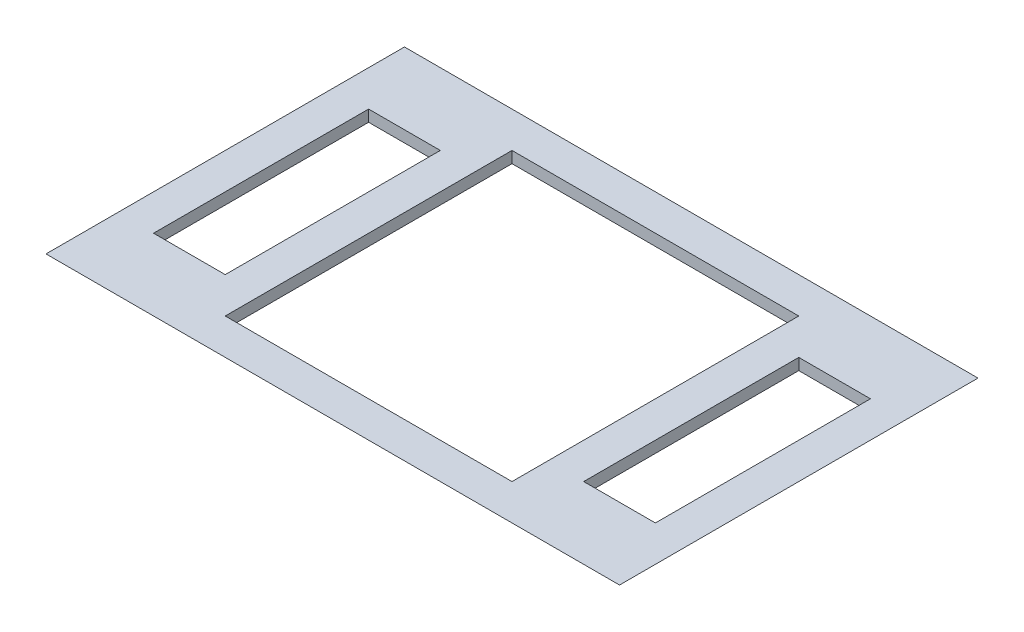
ISO-10303-21;
HEADER;
FILE_DESCRIPTION(('STEP AP214'),'2;1');
FILE_NAME('part.step','',(''),(''),'','','');
FILE_SCHEMA(('AUTOMOTIVE_DESIGN { 1 0 10303 214 1 1 1 1 }'));
ENDSEC;
DATA;
#1=APPLICATION_CONTEXT('core data for automotive mechanical design processes');
#2=APPLICATION_PROTOCOL_DEFINITION('international standard','automotive_design',2000,#1);
#3=PRODUCT_CONTEXT('',#1,'mechanical');
#4=PRODUCT('Part','Part','',(#3));
#5=PRODUCT_RELATED_PRODUCT_CATEGORY('part','',(#4));
#6=PRODUCT_DEFINITION_FORMATION('','',#4);
#7=PRODUCT_DEFINITION_CONTEXT('part definition',#1,'design');
#8=PRODUCT_DEFINITION('design','',#6,#7);
#9=PRODUCT_DEFINITION_SHAPE('','',#8);
#10=(LENGTH_UNIT() NAMED_UNIT(*) SI_UNIT(.MILLI.,.METRE.));
#11=(NAMED_UNIT(*) PLANE_ANGLE_UNIT() SI_UNIT($,.RADIAN.));
#12=(NAMED_UNIT(*) SI_UNIT($,.STERADIAN.) SOLID_ANGLE_UNIT());
#13=UNCERTAINTY_MEASURE_WITH_UNIT(LENGTH_MEASURE(1.E-05),#10,'distance_accuracy_value','');
#14=(GEOMETRIC_REPRESENTATION_CONTEXT(3) GLOBAL_UNCERTAINTY_ASSIGNED_CONTEXT((#13)) GLOBAL_UNIT_ASSIGNED_CONTEXT((#10,
#11,#12)) REPRESENTATION_CONTEXT('',''));
#15=CARTESIAN_POINT('',(0.,0.,0.));
#16=DIRECTION('',(0.,0.,1.));
#17=DIRECTION('',(1.,0.,0.));
#18=AXIS2_PLACEMENT_3D('',#15,#16,#17);
#19=CARTESIAN_POINT('',(0.,12.,-300.));
#20=DIRECTION('',(0.,0.,-1.));
#21=DIRECTION('',(-1.,0.,0.));
#22=AXIS2_PLACEMENT_3D('',#19,#20,#21);
#23=PLANE('',#22);
#24=DIRECTION('',(1.,0.,0.));
#25=VECTOR('',#24,1.);
#26=CARTESIAN_POINT('',(0.,0.,-300.));
#27=LINE('',#26,#25);
#28=CARTESIAN_POINT('',(487.5,0.,-300.));
#29=VERTEX_POINT('',#28);
#30=CARTESIAN_POINT('',(562.5,0.,-300.));
#31=VERTEX_POINT('',#30);
#32=EDGE_CURVE('E254',#29,#31,#27,.T.);
#33=ORIENTED_EDGE('',*,*,#32,.T.);
#34=DIRECTION('',(0.,-1.,0.));
#35=VECTOR('',#34,1.);
#36=CARTESIAN_POINT('',(562.5,12.,-300.));
#37=LINE('',#36,#35);
#38=CARTESIAN_POINT('',(562.5,12.,-300.));
#39=VERTEX_POINT('',#38);
#40=EDGE_CURVE('E200',#39,#31,#37,.T.);
#41=ORIENTED_EDGE('',*,*,#40,.F.);
#42=DIRECTION('',(1.,0.,0.));
#43=VECTOR('',#42,1.);
#44=CARTESIAN_POINT('',(0.,12.,-300.));
#45=LINE('',#44,#43);
#46=CARTESIAN_POINT('',(487.5,12.,-300.));
#47=VERTEX_POINT('',#46);
#48=EDGE_CURVE('E328',#47,#39,#45,.T.);
#49=ORIENTED_EDGE('',*,*,#48,.F.);
#50=DIRECTION('',(0.,-1.,0.));
#51=VECTOR('',#50,1.);
#52=CARTESIAN_POINT('',(487.5,12.,-300.));
#53=LINE('',#52,#51);
#54=EDGE_CURVE('E269',#47,#29,#53,.T.);
#55=ORIENTED_EDGE('',*,*,#54,.T.);
#56=EDGE_LOOP('',(#33,#41,#49,#55));
#57=FACE_BOUND('',#56,.T.);
#58=ADVANCED_FACE('F43',(#57),#23,.F.);
#59=CARTESIAN_POINT('',(562.5,12.,0.));
#60=DIRECTION('',(1.,0.,0.));
#61=DIRECTION('',(0.,0.,-1.));
#62=AXIS2_PLACEMENT_3D('',#59,#60,#61);
#63=PLANE('',#62);
#64=DIRECTION('',(0.,0.,1.));
#65=VECTOR('',#64,1.);
#66=CARTESIAN_POINT('',(562.5,0.,0.));
#67=LINE('',#66,#65);
#68=CARTESIAN_POINT('',(562.5,0.,-75.));
#69=VERTEX_POINT('',#68);
#70=EDGE_CURVE('E258',#31,#69,#67,.T.);
#71=ORIENTED_EDGE('',*,*,#70,.T.);
#72=DIRECTION('',(0.,-1.,0.));
#73=VECTOR('',#72,1.);
#74=CARTESIAN_POINT('',(562.5,12.,-75.));
#75=LINE('',#74,#73);
#76=CARTESIAN_POINT('',(562.5,12.,-75.));
#77=VERTEX_POINT('',#76);
#78=EDGE_CURVE('E276',#77,#69,#75,.T.);
#79=ORIENTED_EDGE('',*,*,#78,.F.);
#80=DIRECTION('',(0.,0.,1.));
#81=VECTOR('',#80,1.);
#82=CARTESIAN_POINT('',(562.5,12.,0.));
#83=LINE('',#82,#81);
#84=EDGE_CURVE('E326',#39,#77,#83,.T.);
#85=ORIENTED_EDGE('',*,*,#84,.F.);
#86=ORIENTED_EDGE('',*,*,#40,.T.);
#87=EDGE_LOOP('',(#71,#79,#85,#86));
#88=FACE_BOUND('',#87,.T.);
#89=ADVANCED_FACE('F325',(#88),#63,.F.);
#90=CARTESIAN_POINT('',(0.,12.,-75.));
#91=DIRECTION('',(0.,0.,-1.));
#92=DIRECTION('',(-1.,0.,0.));
#93=AXIS2_PLACEMENT_3D('',#90,#91,#92);
#94=PLANE('',#93);
#95=DIRECTION('',(1.,0.,0.));
#96=VECTOR('',#95,1.);
#97=CARTESIAN_POINT('',(0.,0.,-75.));
#98=LINE('',#97,#96);
#99=CARTESIAN_POINT('',(487.5,0.,-75.));
#100=VERTEX_POINT('',#99);
#101=EDGE_CURVE('E262',#100,#69,#98,.T.);
#102=ORIENTED_EDGE('',*,*,#101,.F.);
#103=DIRECTION('',(0.,-1.,0.));
#104=VECTOR('',#103,1.);
#105=CARTESIAN_POINT('',(487.5,12.,-75.));
#106=LINE('',#105,#104);
#107=CARTESIAN_POINT('',(487.5,12.,-75.));
#108=VERTEX_POINT('',#107);
#109=EDGE_CURVE('E272',#108,#100,#106,.T.);
#110=ORIENTED_EDGE('',*,*,#109,.F.);
#111=DIRECTION('',(1.,0.,0.));
#112=VECTOR('',#111,1.);
#113=CARTESIAN_POINT('',(0.,12.,-75.));
#114=LINE('',#113,#112);
#115=EDGE_CURVE('E323',#108,#77,#114,.T.);
#116=ORIENTED_EDGE('',*,*,#115,.T.);
#117=ORIENTED_EDGE('',*,*,#78,.T.);
#118=EDGE_LOOP('',(#102,#110,#116,#117));
#119=FACE_BOUND('',#118,.T.);
#120=ADVANCED_FACE('F321',(#119),#94,.T.);
#121=CARTESIAN_POINT('',(0.,12.,-300.));
#122=DIRECTION('',(0.,0.,-1.));
#123=DIRECTION('',(-1.,0.,0.));
#124=AXIS2_PLACEMENT_3D('',#121,#122,#123);
#125=PLANE('',#124);
#126=DIRECTION('',(1.,0.,0.));
#127=VECTOR('',#126,1.);
#128=CARTESIAN_POINT('',(0.,0.,-300.));
#129=LINE('',#128,#127);
#130=CARTESIAN_POINT('',(37.5,0.,-300.));
#131=VERTEX_POINT('',#130);
#132=CARTESIAN_POINT('',(112.5,0.,-300.));
#133=VERTEX_POINT('',#132);
#134=EDGE_CURVE('E238',#131,#133,#129,.T.);
#135=ORIENTED_EDGE('',*,*,#134,.T.);
#136=DIRECTION('',(0.,-1.,0.));
#137=VECTOR('',#136,1.);
#138=CARTESIAN_POINT('',(112.5,12.,-300.));
#139=LINE('',#138,#137);
#140=CARTESIAN_POINT('',(112.5,12.,-300.));
#141=VERTEX_POINT('',#140);
#142=EDGE_CURVE('E273',#141,#133,#139,.T.);
#143=ORIENTED_EDGE('',*,*,#142,.F.);
#144=DIRECTION('',(1.,0.,0.));
#145=VECTOR('',#144,1.);
#146=CARTESIAN_POINT('',(0.,12.,-300.));
#147=LINE('',#146,#145);
#148=CARTESIAN_POINT('',(37.5,12.,-300.));
#149=VERTEX_POINT('',#148);
#150=EDGE_CURVE('E523',#149,#141,#147,.T.);
#151=ORIENTED_EDGE('',*,*,#150,.F.);
#152=DIRECTION('',(0.,-1.,0.));
#153=VECTOR('',#152,1.);
#154=CARTESIAN_POINT('',(37.5,12.,-300.));
#155=LINE('',#154,#153);
#156=EDGE_CURVE('E187',#149,#131,#155,.T.);
#157=ORIENTED_EDGE('',*,*,#156,.T.);
#158=EDGE_LOOP('',(#135,#143,#151,#157));
#159=FACE_BOUND('',#158,.T.);
#160=ADVANCED_FACE('F385',(#159),#125,.F.);
#161=CARTESIAN_POINT('',(112.5,12.,0.));
#162=DIRECTION('',(1.,0.,0.));
#163=DIRECTION('',(0.,0.,-1.));
#164=AXIS2_PLACEMENT_3D('',#161,#162,#163);
#165=PLANE('',#164);
#166=DIRECTION('',(0.,0.,1.));
#167=VECTOR('',#166,1.);
#168=CARTESIAN_POINT('',(112.5,0.,0.));
#169=LINE('',#168,#167);
#170=CARTESIAN_POINT('',(112.5,0.,-75.));
#171=VERTEX_POINT('',#170);
#172=EDGE_CURVE('E242',#133,#171,#169,.T.);
#173=ORIENTED_EDGE('',*,*,#172,.T.);
#174=DIRECTION('',(0.,-1.,0.));
#175=VECTOR('',#174,1.);
#176=CARTESIAN_POINT('',(112.5,12.,-75.));
#177=LINE('',#176,#175);
#178=CARTESIAN_POINT('',(112.5,12.,-75.));
#179=VERTEX_POINT('',#178);
#180=EDGE_CURVE('E284',#179,#171,#177,.T.);
#181=ORIENTED_EDGE('',*,*,#180,.F.);
#182=DIRECTION('',(0.,0.,1.));
#183=VECTOR('',#182,1.);
#184=CARTESIAN_POINT('',(112.5,12.,0.));
#185=LINE('',#184,#183);
#186=EDGE_CURVE('E531',#141,#179,#185,.T.);
#187=ORIENTED_EDGE('',*,*,#186,.F.);
#188=ORIENTED_EDGE('',*,*,#142,.T.);
#189=EDGE_LOOP('',(#173,#181,#187,#188));
#190=FACE_BOUND('',#189,.T.);
#191=ADVANCED_FACE('F381',(#190),#165,.F.);
#192=CARTESIAN_POINT('',(0.,12.,-75.));
#193=DIRECTION('',(0.,0.,-1.));
#194=DIRECTION('',(-1.,0.,0.));
#195=AXIS2_PLACEMENT_3D('',#192,#193,#194);
#196=PLANE('',#195);
#197=DIRECTION('',(1.,0.,0.));
#198=VECTOR('',#197,1.);
#199=CARTESIAN_POINT('',(0.,0.,-75.));
#200=LINE('',#199,#198);
#201=CARTESIAN_POINT('',(37.5,0.,-75.));
#202=VERTEX_POINT('',#201);
#203=EDGE_CURVE('E246',#202,#171,#200,.T.);
#204=ORIENTED_EDGE('',*,*,#203,.F.);
#205=DIRECTION('',(0.,-1.,0.));
#206=VECTOR('',#205,1.);
#207=CARTESIAN_POINT('',(37.5,12.,-75.));
#208=LINE('',#207,#206);
#209=CARTESIAN_POINT('',(37.5,12.,-75.));
#210=VERTEX_POINT('',#209);
#211=EDGE_CURVE('E191',#210,#202,#208,.T.);
#212=ORIENTED_EDGE('',*,*,#211,.F.);
#213=DIRECTION('',(1.,0.,0.));
#214=VECTOR('',#213,1.);
#215=CARTESIAN_POINT('',(0.,12.,-75.));
#216=LINE('',#215,#214);
#217=EDGE_CURVE('E530',#210,#179,#216,.T.);
#218=ORIENTED_EDGE('',*,*,#217,.T.);
#219=ORIENTED_EDGE('',*,*,#180,.T.);
#220=EDGE_LOOP('',(#204,#212,#218,#219));
#221=FACE_BOUND('',#220,.T.);
#222=ADVANCED_FACE('F378',(#221),#196,.T.);
#223=CARTESIAN_POINT('',(0.,12.,-337.5));
#224=DIRECTION('',(0.,0.,-1.));
#225=DIRECTION('',(-1.,0.,0.));
#226=AXIS2_PLACEMENT_3D('',#223,#224,#225);
#227=PLANE('',#226);
#228=DIRECTION('',(1.,0.,0.));
#229=VECTOR('',#228,1.);
#230=CARTESIAN_POINT('',(0.,0.,-337.5));
#231=LINE('',#230,#229);
#232=CARTESIAN_POINT('',(150.,0.,-337.5));
#233=VERTEX_POINT('',#232);
#234=CARTESIAN_POINT('',(450.,0.,-337.5));
#235=VERTEX_POINT('',#234);
#236=EDGE_CURVE('E185',#233,#235,#231,.T.);
#237=ORIENTED_EDGE('',*,*,#236,.T.);
#238=DIRECTION('',(0.,-1.,0.));
#239=VECTOR('',#238,1.);
#240=CARTESIAN_POINT('',(450.,12.,-337.5));
#241=LINE('',#240,#239);
#242=CARTESIAN_POINT('',(450.,12.,-337.5));
#243=VERTEX_POINT('',#242);
#244=EDGE_CURVE('E163',#243,#235,#241,.T.);
#245=ORIENTED_EDGE('',*,*,#244,.F.);
#246=DIRECTION('',(1.,0.,0.));
#247=VECTOR('',#246,1.);
#248=CARTESIAN_POINT('',(0.,12.,-337.5));
#249=LINE('',#248,#247);
#250=CARTESIAN_POINT('',(150.,12.,-337.5));
#251=VERTEX_POINT('',#250);
#252=EDGE_CURVE('E171',#251,#243,#249,.T.);
#253=ORIENTED_EDGE('',*,*,#252,.F.);
#254=DIRECTION('',(0.,-1.,0.));
#255=VECTOR('',#254,1.);
#256=CARTESIAN_POINT('',(150.,12.,-337.5));
#257=LINE('',#256,#255);
#258=EDGE_CURVE('E290',#251,#233,#257,.T.);
#259=ORIENTED_EDGE('',*,*,#258,.T.);
#260=EDGE_LOOP('',(#237,#245,#253,#259));
#261=FACE_BOUND('',#260,.T.);
#262=ADVANCED_FACE('F183',(#261),#227,.F.);
#263=CARTESIAN_POINT('',(450.,12.,0.));
#264=DIRECTION('',(1.,0.,0.));
#265=DIRECTION('',(0.,0.,-1.));
#266=AXIS2_PLACEMENT_3D('',#263,#264,#265);
#267=PLANE('',#266);
#268=DIRECTION('',(0.,0.,1.));
#269=VECTOR('',#268,1.);
#270=CARTESIAN_POINT('',(450.,0.,0.));
#271=LINE('',#270,#269);
#272=CARTESIAN_POINT('',(450.,0.,-37.5));
#273=VERTEX_POINT('',#272);
#274=EDGE_CURVE('E222',#235,#273,#271,.T.);
#275=ORIENTED_EDGE('',*,*,#274,.T.);
#276=DIRECTION('',(0.,-1.,0.));
#277=VECTOR('',#276,1.);
#278=CARTESIAN_POINT('',(450.,12.,-37.5));
#279=LINE('',#278,#277);
#280=CARTESIAN_POINT('',(450.,12.,-37.5));
#281=VERTEX_POINT('',#280);
#282=EDGE_CURVE('E165',#281,#273,#279,.T.);
#283=ORIENTED_EDGE('',*,*,#282,.F.);
#284=DIRECTION('',(0.,0.,1.));
#285=VECTOR('',#284,1.);
#286=CARTESIAN_POINT('',(450.,12.,0.));
#287=LINE('',#286,#285);
#288=EDGE_CURVE('E158',#243,#281,#287,.T.);
#289=ORIENTED_EDGE('',*,*,#288,.F.);
#290=ORIENTED_EDGE('',*,*,#244,.T.);
#291=EDGE_LOOP('',(#275,#283,#289,#290));
#292=FACE_BOUND('',#291,.T.);
#293=ADVANCED_FACE('F161',(#292),#267,.F.);
#294=CARTESIAN_POINT('',(0.,12.,-37.5000000000001));
#295=DIRECTION('',(0.,0.,-1.));
#296=DIRECTION('',(-1.,0.,0.));
#297=AXIS2_PLACEMENT_3D('',#294,#295,#296);
#298=PLANE('',#297);
#299=DIRECTION('',(1.,0.,0.));
#300=VECTOR('',#299,1.);
#301=CARTESIAN_POINT('',(0.,0.,-37.5000000000001));
#302=LINE('',#301,#300);
#303=CARTESIAN_POINT('',(150.,0.,-37.5));
#304=VERTEX_POINT('',#303);
#305=EDGE_CURVE('E225',#304,#273,#302,.T.);
#306=ORIENTED_EDGE('',*,*,#305,.F.);
#307=DIRECTION('',(0.,-1.,0.));
#308=VECTOR('',#307,1.);
#309=CARTESIAN_POINT('',(150.,12.,-37.5));
#310=LINE('',#309,#308);
#311=CARTESIAN_POINT('',(150.,12.,-37.5));
#312=VERTEX_POINT('',#311);
#313=EDGE_CURVE('E193',#312,#304,#310,.T.);
#314=ORIENTED_EDGE('',*,*,#313,.F.);
#315=DIRECTION('',(1.,0.,0.));
#316=VECTOR('',#315,1.);
#317=CARTESIAN_POINT('',(0.,12.,-37.5000000000001));
#318=LINE('',#317,#316);
#319=EDGE_CURVE('E170',#312,#281,#318,.T.);
#320=ORIENTED_EDGE('',*,*,#319,.T.);
#321=ORIENTED_EDGE('',*,*,#282,.T.);
#322=EDGE_LOOP('',(#306,#314,#320,#321));
#323=FACE_BOUND('',#322,.T.);
#324=ADVANCED_FACE('F298',(#323),#298,.T.);
#325=CARTESIAN_POINT('',(487.5,12.,0.));
#326=DIRECTION('',(1.,0.,0.));
#327=DIRECTION('',(0.,0.,-1.));
#328=AXIS2_PLACEMENT_3D('',#325,#326,#327);
#329=PLANE('',#328);
#330=DIRECTION('',(0.,0.,1.));
#331=VECTOR('',#330,1.);
#332=CARTESIAN_POINT('',(487.5,0.,0.));
#333=LINE('',#332,#331);
#334=EDGE_CURVE('E181',#29,#100,#333,.T.);
#335=ORIENTED_EDGE('',*,*,#334,.F.);
#336=ORIENTED_EDGE('',*,*,#54,.F.);
#337=DIRECTION('',(0.,0.,1.));
#338=VECTOR('',#337,1.);
#339=CARTESIAN_POINT('',(487.5,12.,0.));
#340=LINE('',#339,#338);
#341=EDGE_CURVE('E317',#47,#108,#340,.T.);
#342=ORIENTED_EDGE('',*,*,#341,.T.);
#343=ORIENTED_EDGE('',*,*,#109,.T.);
#344=EDGE_LOOP('',(#335,#336,#342,#343));
#345=FACE_BOUND('',#344,.T.);
#346=ADVANCED_FACE('F312',(#345),#329,.T.);
#347=CARTESIAN_POINT('',(37.5,12.,0.));
#348=DIRECTION('',(1.,0.,0.));
#349=DIRECTION('',(0.,0.,-1.));
#350=AXIS2_PLACEMENT_3D('',#347,#348,#349);
#351=PLANE('',#350);
#352=DIRECTION('',(0.,0.,1.));
#353=VECTOR('',#352,1.);
#354=CARTESIAN_POINT('',(37.5,0.,0.));
#355=LINE('',#354,#353);
#356=EDGE_CURVE('E250',#131,#202,#355,.T.);
#357=ORIENTED_EDGE('',*,*,#356,.F.);
#358=ORIENTED_EDGE('',*,*,#156,.F.);
#359=DIRECTION('',(0.,0.,1.));
#360=VECTOR('',#359,1.);
#361=CARTESIAN_POINT('',(37.5,12.,0.));
#362=LINE('',#361,#360);
#363=EDGE_CURVE('E331',#149,#210,#362,.T.);
#364=ORIENTED_EDGE('',*,*,#363,.T.);
#365=ORIENTED_EDGE('',*,*,#211,.T.);
#366=EDGE_LOOP('',(#357,#358,#364,#365));
#367=FACE_BOUND('',#366,.T.);
#368=ADVANCED_FACE('F374',(#367),#351,.T.);
#369=CARTESIAN_POINT('',(150.,12.,0.));
#370=DIRECTION('',(1.,0.,0.));
#371=DIRECTION('',(0.,0.,-1.));
#372=AXIS2_PLACEMENT_3D('',#369,#370,#371);
#373=PLANE('',#372);
#374=DIRECTION('',(0.,0.,1.));
#375=VECTOR('',#374,1.);
#376=CARTESIAN_POINT('',(150.,0.,0.));
#377=LINE('',#376,#375);
#378=EDGE_CURVE('E234',#233,#304,#377,.T.);
#379=ORIENTED_EDGE('',*,*,#378,.F.);
#380=ORIENTED_EDGE('',*,*,#258,.F.);
#381=DIRECTION('',(0.,0.,1.));
#382=VECTOR('',#381,1.);
#383=CARTESIAN_POINT('',(150.,12.,0.));
#384=LINE('',#383,#382);
#385=EDGE_CURVE('E178',#251,#312,#384,.T.);
#386=ORIENTED_EDGE('',*,*,#385,.T.);
#387=ORIENTED_EDGE('',*,*,#313,.T.);
#388=EDGE_LOOP('',(#379,#380,#386,#387));
#389=FACE_BOUND('',#388,.T.);
#390=ADVANCED_FACE('F296',(#389),#373,.T.);
#391=CARTESIAN_POINT('',(0.,12.,0.));
#392=DIRECTION('',(0.,1.,0.));
#393=DIRECTION('',(0.,0.,1.));
#394=AXIS2_PLACEMENT_3D('',#391,#392,#393);
#395=PLANE('',#394);
#396=ORIENTED_EDGE('',*,*,#252,.T.);
#397=ORIENTED_EDGE('',*,*,#288,.T.);
#398=ORIENTED_EDGE('',*,*,#319,.F.);
#399=ORIENTED_EDGE('',*,*,#385,.F.);
#400=EDGE_LOOP('',(#396,#397,#398,#399));
#401=FACE_BOUND('',#400,.T.);
#402=ORIENTED_EDGE('',*,*,#150,.T.);
#403=ORIENTED_EDGE('',*,*,#186,.T.);
#404=ORIENTED_EDGE('',*,*,#217,.F.);
#405=ORIENTED_EDGE('',*,*,#363,.F.);
#406=EDGE_LOOP('',(#402,#403,#404,#405));
#407=FACE_BOUND('',#406,.T.);
#408=ORIENTED_EDGE('',*,*,#48,.T.);
#409=ORIENTED_EDGE('',*,*,#84,.T.);
#410=ORIENTED_EDGE('',*,*,#115,.F.);
#411=ORIENTED_EDGE('',*,*,#341,.F.);
#412=EDGE_LOOP('',(#408,#409,#410,#411));
#413=FACE_BOUND('',#412,.T.);
#414=DIRECTION('',(1.,0.,0.));
#415=VECTOR('',#414,1.);
#416=CARTESIAN_POINT('',(0.,12.,-375.));
#417=LINE('',#416,#415);
#418=CARTESIAN_POINT('',(-1.11022302462516E-13,12.,-375.));
#419=VERTEX_POINT('',#418);
#420=CARTESIAN_POINT('',(600.,12.,-375.));
#421=VERTEX_POINT('',#420);
#422=EDGE_CURVE('E335',#419,#421,#417,.T.);
#423=ORIENTED_EDGE('',*,*,#422,.F.);
#424=DIRECTION('',(0.,0.,-1.));
#425=VECTOR('',#424,1.);
#426=CARTESIAN_POINT('',(0.,12.,0.));
#427=LINE('',#426,#425);
#428=CARTESIAN_POINT('',(0.,12.,0.));
#429=VERTEX_POINT('',#428);
#430=EDGE_CURVE('E339',#429,#419,#427,.T.);
#431=ORIENTED_EDGE('',*,*,#430,.F.);
#432=DIRECTION('',(-1.,0.,0.));
#433=VECTOR('',#432,1.);
#434=CARTESIAN_POINT('',(0.,12.,0.));
#435=LINE('',#434,#433);
#436=CARTESIAN_POINT('',(600.,12.,0.));
#437=VERTEX_POINT('',#436);
#438=EDGE_CURVE('E346',#437,#429,#435,.T.);
#439=ORIENTED_EDGE('',*,*,#438,.F.);
#440=DIRECTION('',(0.,0.,1.));
#441=VECTOR('',#440,1.);
#442=CARTESIAN_POINT('',(600.,12.,1.77635683940025E-13));
#443=LINE('',#442,#441);
#444=EDGE_CURVE('E228',#421,#437,#443,.T.);
#445=ORIENTED_EDGE('',*,*,#444,.F.);
#446=EDGE_LOOP('',(#423,#431,#439,#445));
#447=FACE_BOUND('',#446,.T.);
#448=ADVANCED_FACE('F175',(#401,#407,#413,#447),#395,.T.);
#449=CARTESIAN_POINT('',(0.,0.,0.));
#450=DIRECTION('',(0.,1.,0.));
#451=DIRECTION('',(0.,0.,1.));
#452=AXIS2_PLACEMENT_3D('',#449,#450,#451);
#453=PLANE('',#452);
#454=DIRECTION('',(-1.,0.,0.));
#455=VECTOR('',#454,1.);
#456=CARTESIAN_POINT('',(0.,0.,-12.));
#457=LINE('',#456,#455);
#458=CARTESIAN_POINT('',(588.,0.,-12.));
#459=VERTEX_POINT('',#458);
#460=CARTESIAN_POINT('',(12.,0.,-12.));
#461=VERTEX_POINT('',#460);
#462=EDGE_CURVE('E54',#459,#461,#457,.T.);
#463=ORIENTED_EDGE('',*,*,#462,.T.);
#464=DIRECTION('',(0.,0.,-1.));
#465=VECTOR('',#464,1.);
#466=CARTESIAN_POINT('',(11.9999999999999,0.,-375.));
#467=LINE('',#466,#465);
#468=CARTESIAN_POINT('',(11.9999999999999,0.,-363.));
#469=VERTEX_POINT('',#468);
#470=EDGE_CURVE('E11',#461,#469,#467,.T.);
#471=ORIENTED_EDGE('',*,*,#470,.T.);
#472=DIRECTION('',(1.,0.,0.));
#473=VECTOR('',#472,1.);
#474=CARTESIAN_POINT('',(600.,0.,-363.));
#475=LINE('',#474,#473);
#476=CARTESIAN_POINT('',(588.,0.,-363.));
#477=VERTEX_POINT('',#476);
#478=EDGE_CURVE('E197',#469,#477,#475,.T.);
#479=ORIENTED_EDGE('',*,*,#478,.T.);
#480=DIRECTION('',(0.,0.,1.));
#481=VECTOR('',#480,1.);
#482=CARTESIAN_POINT('',(588.,0.,0.));
#483=LINE('',#482,#481);
#484=EDGE_CURVE('E65',#477,#459,#483,.T.);
#485=ORIENTED_EDGE('',*,*,#484,.T.);
#486=EDGE_LOOP('',(#463,#471,#479,#485));
#487=FACE_BOUND('',#486,.T.);
#488=ORIENTED_EDGE('',*,*,#236,.F.);
#489=ORIENTED_EDGE('',*,*,#378,.T.);
#490=ORIENTED_EDGE('',*,*,#305,.T.);
#491=ORIENTED_EDGE('',*,*,#274,.F.);
#492=EDGE_LOOP('',(#488,#489,#490,#491));
#493=FACE_BOUND('',#492,.T.);
#494=ORIENTED_EDGE('',*,*,#134,.F.);
#495=ORIENTED_EDGE('',*,*,#356,.T.);
#496=ORIENTED_EDGE('',*,*,#203,.T.);
#497=ORIENTED_EDGE('',*,*,#172,.F.);
#498=EDGE_LOOP('',(#494,#495,#496,#497));
#499=FACE_BOUND('',#498,.T.);
#500=ORIENTED_EDGE('',*,*,#32,.F.);
#501=ORIENTED_EDGE('',*,*,#334,.T.);
#502=ORIENTED_EDGE('',*,*,#101,.T.);
#503=ORIENTED_EDGE('',*,*,#70,.F.);
#504=EDGE_LOOP('',(#500,#501,#502,#503));
#505=FACE_BOUND('',#504,.T.);
#506=ADVANCED_FACE('F300',(#487,#493,#499,#505),#453,.F.);
#507=CARTESIAN_POINT('',(588.,0.,1.74082970261225E-13));
#508=DIRECTION('',(0.70710678118655,-0.707106781186545,0.));
#509=DIRECTION('',(0.,0.,-1.));
#510=AXIS2_PLACEMENT_3D('',#507,#508,#509);
#511=PLANE('',#510);
#512=DIRECTION('',(-0.577350269189623,-0.577350269189627,0.577350269189628));
#513=VECTOR('',#512,1.);
#514=CARTESIAN_POINT('',(392.000000000002,-195.999999999999,-167.));
#515=LINE('',#514,#513);
#516=EDGE_CURVE('E210',#421,#477,#515,.T.);
#517=ORIENTED_EDGE('',*,*,#516,.F.);
#518=ORIENTED_EDGE('',*,*,#444,.T.);
#519=DIRECTION('',(-0.577350269189622,-0.577350269189627,-0.577350269189628));
#520=VECTOR('',#519,1.);
#521=CARTESIAN_POINT('',(592.,4.00000000000009,-7.99999999999992));
#522=LINE('',#521,#520);
#523=EDGE_CURVE('E48',#459,#437,#522,.F.);
#524=ORIENTED_EDGE('',*,*,#523,.F.);
#525=ORIENTED_EDGE('',*,*,#484,.F.);
#526=EDGE_LOOP('',(#517,#518,#524,#525));
#527=FACE_BOUND('',#526,.T.);
#528=ADVANCED_FACE('F46',(#527),#511,.T.);
#529=CARTESIAN_POINT('',(0.,0.,-12.));
#530=DIRECTION('',(0.,-0.707106781186548,0.707106781186547));
#531=DIRECTION('',(1.,0.,0.));
#532=AXIS2_PLACEMENT_3D('',#529,#530,#531);
#533=PLANE('',#532);
#534=ORIENTED_EDGE('',*,*,#523,.T.);
#535=ORIENTED_EDGE('',*,*,#438,.T.);
#536=DIRECTION('',(0.577350269189626,-0.577350269189625,-0.577350269189626));
#537=VECTOR('',#536,1.);
#538=CARTESIAN_POINT('',(8.,4.,-8.00000000000001));
#539=LINE('',#538,#537);
#540=EDGE_CURVE('E208',#461,#429,#539,.F.);
#541=ORIENTED_EDGE('',*,*,#540,.F.);
#542=ORIENTED_EDGE('',*,*,#462,.F.);
#543=EDGE_LOOP('',(#534,#535,#541,#542));
#544=FACE_BOUND('',#543,.T.);
#545=ADVANCED_FACE('F358',(#544),#533,.T.);
#546=CARTESIAN_POINT('',(0.,0.,-363.));
#547=DIRECTION('',(0.,-0.707106781186548,-0.707106781186547));
#548=DIRECTION('',(-1.,0.,0.));
#549=AXIS2_PLACEMENT_3D('',#546,#547,#548);
#550=PLANE('',#549);
#551=ORIENTED_EDGE('',*,*,#516,.T.);
#552=ORIENTED_EDGE('',*,*,#478,.F.);
#553=DIRECTION('',(-0.577350269189626,0.577350269189625,-0.577350269189626));
#554=VECTOR('',#553,1.);
#555=CARTESIAN_POINT('',(7.99999999999993,3.99999999999997,-367.));
#556=LINE('',#555,#554);
#557=EDGE_CURVE('E205',#419,#469,#556,.F.);
#558=ORIENTED_EDGE('',*,*,#557,.F.);
#559=ORIENTED_EDGE('',*,*,#422,.T.);
#560=EDGE_LOOP('',(#551,#552,#558,#559));
#561=FACE_BOUND('',#560,.T.);
#562=ADVANCED_FACE('F356',(#561),#550,.T.);
#563=CARTESIAN_POINT('',(12.,0.,0.));
#564=DIRECTION('',(-0.707106781186547,-0.707106781186548,0.));
#565=DIRECTION('',(0.,0.,1.));
#566=AXIS2_PLACEMENT_3D('',#563,#564,#565);
#567=PLANE('',#566);
#568=ORIENTED_EDGE('',*,*,#540,.T.);
#569=ORIENTED_EDGE('',*,*,#430,.T.);
#570=ORIENTED_EDGE('',*,*,#557,.T.);
#571=ORIENTED_EDGE('',*,*,#470,.F.);
#572=EDGE_LOOP('',(#568,#569,#570,#571));
#573=FACE_BOUND('',#572,.T.);
#574=ADVANCED_FACE('F354',(#573),#567,.T.);
#575=CLOSED_SHELL('',(#58,#89,#120,#160,#191,#222,#262,#293,#324,#346,#368,#390,#448,#506,#528,
#545,#562,#574));
#576=MANIFOLD_SOLID_BREP('B2',#575);
#577=ADVANCED_BREP_SHAPE_REPRESENTATION('',(#18,#576),#14);
#578=SHAPE_DEFINITION_REPRESENTATION(#9,#577);
ENDSEC;
END-ISO-10303-21;
